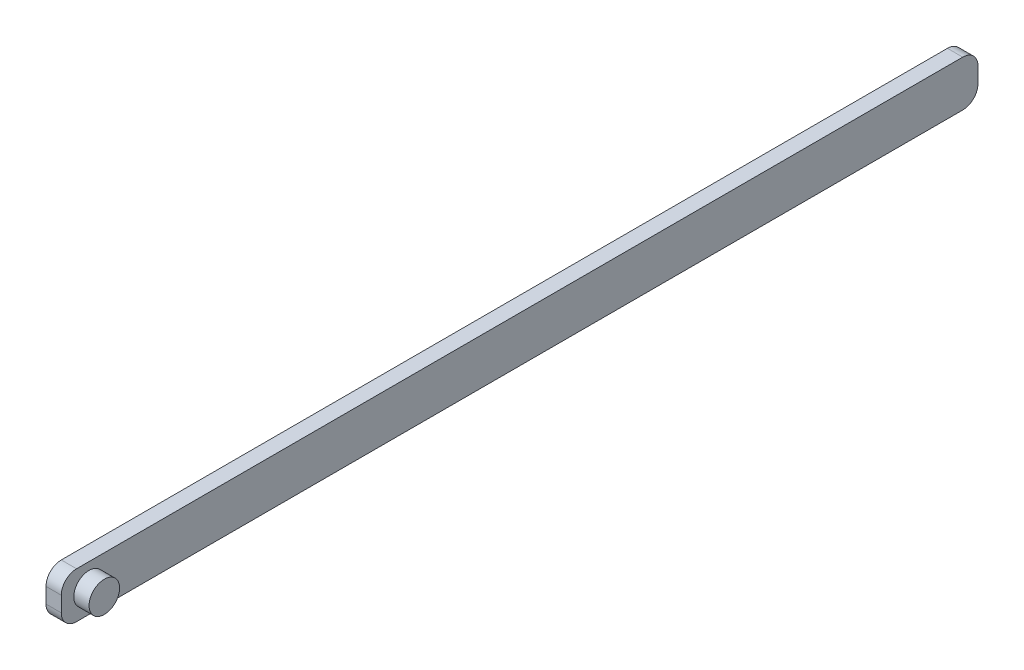
ISO-10303-21;
HEADER;
FILE_DESCRIPTION(('STEP AP214'),'2;1');
FILE_NAME('part.step','',(''),(''),'','','');
FILE_SCHEMA(('AUTOMOTIVE_DESIGN { 1 0 10303 214 1 1 1 1 }'));
ENDSEC;
DATA;
#1=APPLICATION_CONTEXT('core data for automotive mechanical design processes');
#2=APPLICATION_PROTOCOL_DEFINITION('international standard','automotive_design',2000,#1);
#3=PRODUCT_CONTEXT('',#1,'mechanical');
#4=PRODUCT('Part','Part','',(#3));
#5=PRODUCT_RELATED_PRODUCT_CATEGORY('part','',(#4));
#6=PRODUCT_DEFINITION_FORMATION('','',#4);
#7=PRODUCT_DEFINITION_CONTEXT('part definition',#1,'design');
#8=PRODUCT_DEFINITION('design','',#6,#7);
#9=PRODUCT_DEFINITION_SHAPE('','',#8);
#10=(LENGTH_UNIT() NAMED_UNIT(*) SI_UNIT(.MILLI.,.METRE.));
#11=(NAMED_UNIT(*) PLANE_ANGLE_UNIT() SI_UNIT($,.RADIAN.));
#12=(NAMED_UNIT(*) SI_UNIT($,.STERADIAN.) SOLID_ANGLE_UNIT());
#13=UNCERTAINTY_MEASURE_WITH_UNIT(LENGTH_MEASURE(1.E-05),#10,'distance_accuracy_value','');
#14=(GEOMETRIC_REPRESENTATION_CONTEXT(3) GLOBAL_UNCERTAINTY_ASSIGNED_CONTEXT((#13)) GLOBAL_UNIT_ASSIGNED_CONTEXT((#10,
#11,#12)) REPRESENTATION_CONTEXT('',''));
#15=CARTESIAN_POINT('',(0.,0.,0.));
#16=DIRECTION('',(0.,0.,1.));
#17=DIRECTION('',(1.,0.,0.));
#18=AXIS2_PLACEMENT_3D('',#15,#16,#17);
#19=CARTESIAN_POINT('',(10.,-1.09113484965698,-560.68967632511));
#20=DIRECTION('',(-1.,0.,0.));
#21=DIRECTION('',(0.,0.,1.));
#22=AXIS2_PLACEMENT_3D('',#19,#20,#21);
#23=CYLINDRICAL_SURFACE('',#22,10.);
#24=CARTESIAN_POINT('',(0.,-1.09113484965698,-560.68967632511));
#25=DIRECTION('',(1.,0.,0.));
#26=DIRECTION('',(0.,0.,-1.));
#27=AXIS2_PLACEMENT_3D('',#24,#25,#26);
#28=CIRCLE('',#27,10.);
#29=CARTESIAN_POINT('',(0.,-11.091134849657,-560.68967632511));
#30=VERTEX_POINT('',#29);
#31=CARTESIAN_POINT('',(0.,-1.09113484965698,-570.68967632511));
#32=VERTEX_POINT('',#31);
#33=EDGE_CURVE('E142',#30,#32,#28,.T.);
#34=ORIENTED_EDGE('',*,*,#33,.T.);
#35=DIRECTION('',(-1.,0.,0.));
#36=VECTOR('',#35,1.);
#37=CARTESIAN_POINT('',(10.,-1.09113484965698,-570.68967632511));
#38=LINE('',#37,#36);
#39=CARTESIAN_POINT('',(10.,-1.09113484965698,-570.68967632511));
#40=VERTEX_POINT('',#39);
#41=EDGE_CURVE('E13',#40,#32,#38,.T.);
#42=ORIENTED_EDGE('',*,*,#41,.F.);
#43=CARTESIAN_POINT('',(10.,-1.09113484965698,-560.68967632511));
#44=DIRECTION('',(1.,0.,0.));
#45=DIRECTION('',(0.,0.,-1.));
#46=AXIS2_PLACEMENT_3D('',#43,#44,#45);
#47=CIRCLE('',#46,10.);
#48=CARTESIAN_POINT('',(10.,-11.091134849657,-560.68967632511));
#49=VERTEX_POINT('',#48);
#50=EDGE_CURVE('E157',#49,#40,#47,.T.);
#51=ORIENTED_EDGE('',*,*,#50,.F.);
#52=DIRECTION('',(-1.,0.,0.));
#53=VECTOR('',#52,1.);
#54=CARTESIAN_POINT('',(10.,-11.091134849657,-560.68967632511));
#55=LINE('',#54,#53);
#56=EDGE_CURVE('E138',#49,#30,#55,.T.);
#57=ORIENTED_EDGE('',*,*,#56,.T.);
#58=EDGE_LOOP('',(#34,#42,#51,#57));
#59=FACE_BOUND('',#58,.T.);
#60=ADVANCED_FACE('F46',(#59),#23,.T.);
#61=CARTESIAN_POINT('',(10.,8.90886515034302,-570.68967632511));
#62=DIRECTION('',(0.,0.,1.));
#63=DIRECTION('',(1.,0.,0.));
#64=AXIS2_PLACEMENT_3D('',#61,#62,#63);
#65=PLANE('',#64);
#66=DIRECTION('',(0.,1.,0.));
#67=VECTOR('',#66,1.);
#68=CARTESIAN_POINT('',(0.,8.90886515034302,-570.68967632511));
#69=LINE('',#68,#67);
#70=CARTESIAN_POINT('',(0.,8.90886515034302,-570.68967632511));
#71=VERTEX_POINT('',#70);
#72=EDGE_CURVE('E145',#32,#71,#69,.T.);
#73=ORIENTED_EDGE('',*,*,#72,.T.);
#74=DIRECTION('',(-1.,0.,0.));
#75=VECTOR('',#74,1.);
#76=CARTESIAN_POINT('',(10.,8.90886515034302,-570.68967632511));
#77=LINE('',#76,#75);
#78=CARTESIAN_POINT('',(10.,8.90886515034302,-570.68967632511));
#79=VERTEX_POINT('',#78);
#80=EDGE_CURVE('E54',#79,#71,#77,.T.);
#81=ORIENTED_EDGE('',*,*,#80,.F.);
#82=DIRECTION('',(0.,1.,0.));
#83=VECTOR('',#82,1.);
#84=CARTESIAN_POINT('',(10.,8.90886515034302,-570.68967632511));
#85=LINE('',#84,#83);
#86=EDGE_CURVE('E105',#40,#79,#85,.T.);
#87=ORIENTED_EDGE('',*,*,#86,.F.);
#88=ORIENTED_EDGE('',*,*,#41,.T.);
#89=EDGE_LOOP('',(#73,#81,#87,#88));
#90=FACE_BOUND('',#89,.T.);
#91=ADVANCED_FACE('F214',(#90),#65,.F.);
#92=CARTESIAN_POINT('',(10.,8.90886515034302,-560.68967632511));
#93=DIRECTION('',(-1.,0.,0.));
#94=DIRECTION('',(0.,0.,1.));
#95=AXIS2_PLACEMENT_3D('',#92,#93,#94);
#96=CYLINDRICAL_SURFACE('',#95,10.);
#97=CARTESIAN_POINT('',(0.,8.90886515034302,-560.68967632511));
#98=DIRECTION('',(1.,0.,0.));
#99=DIRECTION('',(0.,0.,1.));
#100=AXIS2_PLACEMENT_3D('',#97,#98,#99);
#101=CIRCLE('',#100,10.);
#102=CARTESIAN_POINT('',(0.,18.908865150343,-560.68967632511));
#103=VERTEX_POINT('',#102);
#104=EDGE_CURVE('E148',#71,#103,#101,.T.);
#105=ORIENTED_EDGE('',*,*,#104,.T.);
#106=DIRECTION('',(-1.,0.,0.));
#107=VECTOR('',#106,1.);
#108=CARTESIAN_POINT('',(10.,18.908865150343,-560.68967632511));
#109=LINE('',#108,#107);
#110=CARTESIAN_POINT('',(10.,18.908865150343,-560.68967632511));
#111=VERTEX_POINT('',#110);
#112=EDGE_CURVE('E164',#111,#103,#109,.T.);
#113=ORIENTED_EDGE('',*,*,#112,.F.);
#114=CARTESIAN_POINT('',(10.,8.90886515034302,-560.68967632511));
#115=DIRECTION('',(1.,0.,0.));
#116=DIRECTION('',(0.,0.,1.));
#117=AXIS2_PLACEMENT_3D('',#114,#115,#116);
#118=CIRCLE('',#117,10.);
#119=EDGE_CURVE('E172',#79,#111,#118,.T.);
#120=ORIENTED_EDGE('',*,*,#119,.F.);
#121=ORIENTED_EDGE('',*,*,#80,.T.);
#122=EDGE_LOOP('',(#105,#113,#120,#121));
#123=FACE_BOUND('',#122,.T.);
#124=ADVANCED_FACE('F170',(#123),#96,.T.);
#125=CARTESIAN_POINT('',(10.,18.908865150343,19.3103236748901));
#126=DIRECTION('',(0.,-1.,0.));
#127=DIRECTION('',(0.,0.,-1.));
#128=AXIS2_PLACEMENT_3D('',#125,#126,#127);
#129=PLANE('',#128);
#130=DIRECTION('',(0.,0.,1.));
#131=VECTOR('',#130,1.);
#132=CARTESIAN_POINT('',(0.,18.908865150343,19.3103236748901));
#133=LINE('',#132,#131);
#134=CARTESIAN_POINT('',(0.,18.908865150343,19.3103236748901));
#135=VERTEX_POINT('',#134);
#136=EDGE_CURVE('E150',#103,#135,#133,.T.);
#137=ORIENTED_EDGE('',*,*,#136,.T.);
#138=DIRECTION('',(-1.,0.,0.));
#139=VECTOR('',#138,1.);
#140=CARTESIAN_POINT('',(10.,18.908865150343,19.3103236748901));
#141=LINE('',#140,#139);
#142=CARTESIAN_POINT('',(10.,18.908865150343,19.3103236748901));
#143=VERTEX_POINT('',#142);
#144=EDGE_CURVE('E161',#143,#135,#141,.T.);
#145=ORIENTED_EDGE('',*,*,#144,.F.);
#146=DIRECTION('',(0.,0.,1.));
#147=VECTOR('',#146,1.);
#148=CARTESIAN_POINT('',(10.,18.908865150343,19.3103236748901));
#149=LINE('',#148,#147);
#150=EDGE_CURVE('E184',#111,#143,#149,.T.);
#151=ORIENTED_EDGE('',*,*,#150,.F.);
#152=ORIENTED_EDGE('',*,*,#112,.T.);
#153=EDGE_LOOP('',(#137,#145,#151,#152));
#154=FACE_BOUND('',#153,.T.);
#155=ADVANCED_FACE('F180',(#154),#129,.F.);
#156=CARTESIAN_POINT('',(10.,8.90886515034302,19.3103236748902));
#157=DIRECTION('',(-1.,0.,0.));
#158=DIRECTION('',(0.,0.,1.));
#159=AXIS2_PLACEMENT_3D('',#156,#157,#158);
#160=CYLINDRICAL_SURFACE('',#159,10.);
#161=CARTESIAN_POINT('',(0.,8.90886515034302,19.3103236748902));
#162=DIRECTION('',(1.,0.,0.));
#163=DIRECTION('',(0.,0.,-1.));
#164=AXIS2_PLACEMENT_3D('',#161,#162,#163);
#165=CIRCLE('',#164,10.);
#166=CARTESIAN_POINT('',(0.,8.90886515034295,29.3103236748902));
#167=VERTEX_POINT('',#166);
#168=EDGE_CURVE('E152',#135,#167,#165,.T.);
#169=ORIENTED_EDGE('',*,*,#168,.T.);
#170=DIRECTION('',(-1.,0.,0.));
#171=VECTOR('',#170,1.);
#172=CARTESIAN_POINT('',(10.,8.90886515034295,29.3103236748902));
#173=LINE('',#172,#171);
#174=CARTESIAN_POINT('',(10.,8.90886515034295,29.3103236748902));
#175=VERTEX_POINT('',#174);
#176=EDGE_CURVE('E133',#175,#167,#173,.T.);
#177=ORIENTED_EDGE('',*,*,#176,.F.);
#178=CARTESIAN_POINT('',(10.,8.90886515034302,19.3103236748902));
#179=DIRECTION('',(1.,0.,0.));
#180=DIRECTION('',(0.,0.,-1.));
#181=AXIS2_PLACEMENT_3D('',#178,#179,#180);
#182=CIRCLE('',#181,10.);
#183=EDGE_CURVE('E124',#143,#175,#182,.T.);
#184=ORIENTED_EDGE('',*,*,#183,.F.);
#185=ORIENTED_EDGE('',*,*,#144,.T.);
#186=EDGE_LOOP('',(#169,#177,#184,#185));
#187=FACE_BOUND('',#186,.T.);
#188=ADVANCED_FACE('F183',(#187),#160,.T.);
#189=CARTESIAN_POINT('',(10.,8.90886515034295,29.3103236748902));
#190=DIRECTION('',(0.,0.,-1.));
#191=DIRECTION('',(-1.,0.,0.));
#192=AXIS2_PLACEMENT_3D('',#189,#190,#191);
#193=PLANE('',#192);
#194=DIRECTION('',(0.,-1.,0.));
#195=VECTOR('',#194,1.);
#196=CARTESIAN_POINT('',(0.,8.90886515034295,29.3103236748902));
#197=LINE('',#196,#195);
#198=CARTESIAN_POINT('',(0.,-1.09113484965691,29.3103236748902));
#199=VERTEX_POINT('',#198);
#200=EDGE_CURVE('E132',#167,#199,#197,.T.);
#201=ORIENTED_EDGE('',*,*,#200,.T.);
#202=DIRECTION('',(-1.,0.,0.));
#203=VECTOR('',#202,1.);
#204=CARTESIAN_POINT('',(10.,-1.09113484965691,29.3103236748902));
#205=LINE('',#204,#203);
#206=CARTESIAN_POINT('',(10.,-1.09113484965691,29.3103236748902));
#207=VERTEX_POINT('',#206);
#208=EDGE_CURVE('E129',#207,#199,#205,.T.);
#209=ORIENTED_EDGE('',*,*,#208,.F.);
#210=DIRECTION('',(0.,-1.,0.));
#211=VECTOR('',#210,1.);
#212=CARTESIAN_POINT('',(10.,8.90886515034295,29.3103236748902));
#213=LINE('',#212,#211);
#214=EDGE_CURVE('E118',#175,#207,#213,.T.);
#215=ORIENTED_EDGE('',*,*,#214,.F.);
#216=ORIENTED_EDGE('',*,*,#176,.T.);
#217=EDGE_LOOP('',(#201,#209,#215,#216));
#218=FACE_BOUND('',#217,.T.);
#219=ADVANCED_FACE('F130',(#218),#193,.F.);
#220=CARTESIAN_POINT('',(10.,-1.09113484965698,19.3103236748902));
#221=DIRECTION('',(-1.,0.,0.));
#222=DIRECTION('',(0.,0.,1.));
#223=AXIS2_PLACEMENT_3D('',#220,#221,#222);
#224=CYLINDRICAL_SURFACE('',#223,10.);
#225=CARTESIAN_POINT('',(0.,-1.09113484965698,19.3103236748902));
#226=DIRECTION('',(1.,0.,0.));
#227=DIRECTION('',(0.,0.,-1.));
#228=AXIS2_PLACEMENT_3D('',#225,#226,#227);
#229=CIRCLE('',#228,10.);
#230=CARTESIAN_POINT('',(0.,-11.091134849657,19.3103236748901));
#231=VERTEX_POINT('',#230);
#232=EDGE_CURVE('E91',#199,#231,#229,.T.);
#233=ORIENTED_EDGE('',*,*,#232,.T.);
#234=DIRECTION('',(-1.,0.,0.));
#235=VECTOR('',#234,1.);
#236=CARTESIAN_POINT('',(10.,-11.091134849657,19.3103236748901));
#237=LINE('',#236,#235);
#238=CARTESIAN_POINT('',(10.,-11.091134849657,19.3103236748901));
#239=VERTEX_POINT('',#238);
#240=EDGE_CURVE('E134',#239,#231,#237,.T.);
#241=ORIENTED_EDGE('',*,*,#240,.F.);
#242=CARTESIAN_POINT('',(10.,-1.09113484965698,19.3103236748902));
#243=DIRECTION('',(1.,0.,0.));
#244=DIRECTION('',(0.,0.,-1.));
#245=AXIS2_PLACEMENT_3D('',#242,#243,#244);
#246=CIRCLE('',#245,10.);
#247=EDGE_CURVE('E122',#207,#239,#246,.T.);
#248=ORIENTED_EDGE('',*,*,#247,.F.);
#249=ORIENTED_EDGE('',*,*,#208,.T.);
#250=EDGE_LOOP('',(#233,#241,#248,#249));
#251=FACE_BOUND('',#250,.T.);
#252=ADVANCED_FACE('F136',(#251),#224,.T.);
#253=CARTESIAN_POINT('',(10.,-11.091134849657,19.3103236748901));
#254=DIRECTION('',(0.,1.,0.));
#255=DIRECTION('',(0.,0.,1.));
#256=AXIS2_PLACEMENT_3D('',#253,#254,#255);
#257=PLANE('',#256);
#258=DIRECTION('',(0.,0.,-1.));
#259=VECTOR('',#258,1.);
#260=CARTESIAN_POINT('',(0.,-11.091134849657,19.3103236748901));
#261=LINE('',#260,#259);
#262=EDGE_CURVE('E97',#231,#30,#261,.T.);
#263=ORIENTED_EDGE('',*,*,#262,.T.);
#264=ORIENTED_EDGE('',*,*,#56,.F.);
#265=DIRECTION('',(0.,0.,-1.));
#266=VECTOR('',#265,1.);
#267=CARTESIAN_POINT('',(10.,-11.091134849657,19.3103236748901));
#268=LINE('',#267,#266);
#269=EDGE_CURVE('E62',#239,#49,#268,.T.);
#270=ORIENTED_EDGE('',*,*,#269,.F.);
#271=ORIENTED_EDGE('',*,*,#240,.T.);
#272=EDGE_LOOP('',(#263,#264,#270,#271));
#273=FACE_BOUND('',#272,.T.);
#274=ADVANCED_FACE('F205',(#273),#257,.F.);
#275=CARTESIAN_POINT('',(10.,-1.09113484965698,-560.68967632511));
#276=DIRECTION('',(1.,0.,0.));
#277=DIRECTION('',(0.,0.,-1.));
#278=AXIS2_PLACEMENT_3D('',#275,#276,#277);
#279=PLANE('',#278);
#280=CARTESIAN_POINT('',(10.,3.90886515034302,11.1352882925004));
#281=DIRECTION('',(1.,0.,0.));
#282=DIRECTION('',(0.,0.,-1.));
#283=AXIS2_PLACEMENT_3D('',#280,#281,#282);
#284=CIRCLE('',#283,10.);
#285=CARTESIAN_POINT('',(10.,3.90886515034302,1.13528829250043));
#286=VERTEX_POINT('',#285);
#287=EDGE_CURVE('E190',#286,#286,#284,.T.);
#288=ORIENTED_EDGE('',*,*,#287,.F.);
#289=EDGE_LOOP('',(#288));
#290=FACE_BOUND('',#289,.T.);
#291=ORIENTED_EDGE('',*,*,#50,.T.);
#292=ORIENTED_EDGE('',*,*,#86,.T.);
#293=ORIENTED_EDGE('',*,*,#119,.T.);
#294=ORIENTED_EDGE('',*,*,#150,.T.);
#295=ORIENTED_EDGE('',*,*,#183,.T.);
#296=ORIENTED_EDGE('',*,*,#214,.T.);
#297=ORIENTED_EDGE('',*,*,#247,.T.);
#298=ORIENTED_EDGE('',*,*,#269,.T.);
#299=EDGE_LOOP('',(#291,#292,#293,#294,#295,#296,#297,#298));
#300=FACE_BOUND('',#299,.T.);
#301=ADVANCED_FACE('F120',(#290,#300),#279,.T.);
#302=CARTESIAN_POINT('',(0.,-1.09113484965698,-560.68967632511));
#303=DIRECTION('',(1.,0.,0.));
#304=DIRECTION('',(0.,0.,-1.));
#305=AXIS2_PLACEMENT_3D('',#302,#303,#304);
#306=PLANE('',#305);
#307=ORIENTED_EDGE('',*,*,#33,.F.);
#308=ORIENTED_EDGE('',*,*,#262,.F.);
#309=ORIENTED_EDGE('',*,*,#232,.F.);
#310=ORIENTED_EDGE('',*,*,#200,.F.);
#311=ORIENTED_EDGE('',*,*,#168,.F.);
#312=ORIENTED_EDGE('',*,*,#136,.F.);
#313=ORIENTED_EDGE('',*,*,#104,.F.);
#314=ORIENTED_EDGE('',*,*,#72,.F.);
#315=EDGE_LOOP('',(#307,#308,#309,#310,#311,#312,#313,#314));
#316=FACE_BOUND('',#315,.T.);
#317=ADVANCED_FACE('F176',(#316),#306,.F.);
#318=CARTESIAN_POINT('',(20.,3.90886515034302,11.1352882925004));
#319=DIRECTION('',(-1.,0.,0.));
#320=DIRECTION('',(0.,0.,1.));
#321=AXIS2_PLACEMENT_3D('',#318,#319,#320);
#322=CYLINDRICAL_SURFACE('',#321,10.);
#323=CARTESIAN_POINT('',(20.,3.90886515034302,11.1352882925004));
#324=DIRECTION('',(1.,0.,0.));
#325=DIRECTION('',(0.,0.,-1.));
#326=AXIS2_PLACEMENT_3D('',#323,#324,#325);
#327=CIRCLE('',#326,10.);
#328=CARTESIAN_POINT('',(20.,3.90886515034302,1.13528829250043));
#329=VERTEX_POINT('',#328);
#330=EDGE_CURVE('E146',#329,#329,#327,.T.);
#331=ORIENTED_EDGE('',*,*,#330,.F.);
#332=EDGE_LOOP('',(#331));
#333=FACE_BOUND('',#332,.T.);
#334=ORIENTED_EDGE('',*,*,#287,.T.);
#335=EDGE_LOOP('',(#334));
#336=FACE_BOUND('',#335,.T.);
#337=ADVANCED_FACE('F198',(#333,#336),#322,.T.);
#338=CARTESIAN_POINT('',(20.,3.90886515034302,11.1352882925004));
#339=DIRECTION('',(1.,0.,0.));
#340=DIRECTION('',(0.,0.,-1.));
#341=AXIS2_PLACEMENT_3D('',#338,#339,#340);
#342=PLANE('',#341);
#343=ORIENTED_EDGE('',*,*,#330,.T.);
#344=EDGE_LOOP('',(#343));
#345=FACE_BOUND('',#344,.T.);
#346=ADVANCED_FACE('F196',(#345),#342,.T.);
#347=CLOSED_SHELL('',(#60,#91,#124,#155,#188,#219,#252,#274,#301,#317,#337,#346));
#348=MANIFOLD_SOLID_BREP('B2',#347);
#349=ADVANCED_BREP_SHAPE_REPRESENTATION('',(#18,#348),#14);
#350=SHAPE_DEFINITION_REPRESENTATION(#9,#349);
ENDSEC;
END-ISO-10303-21;
